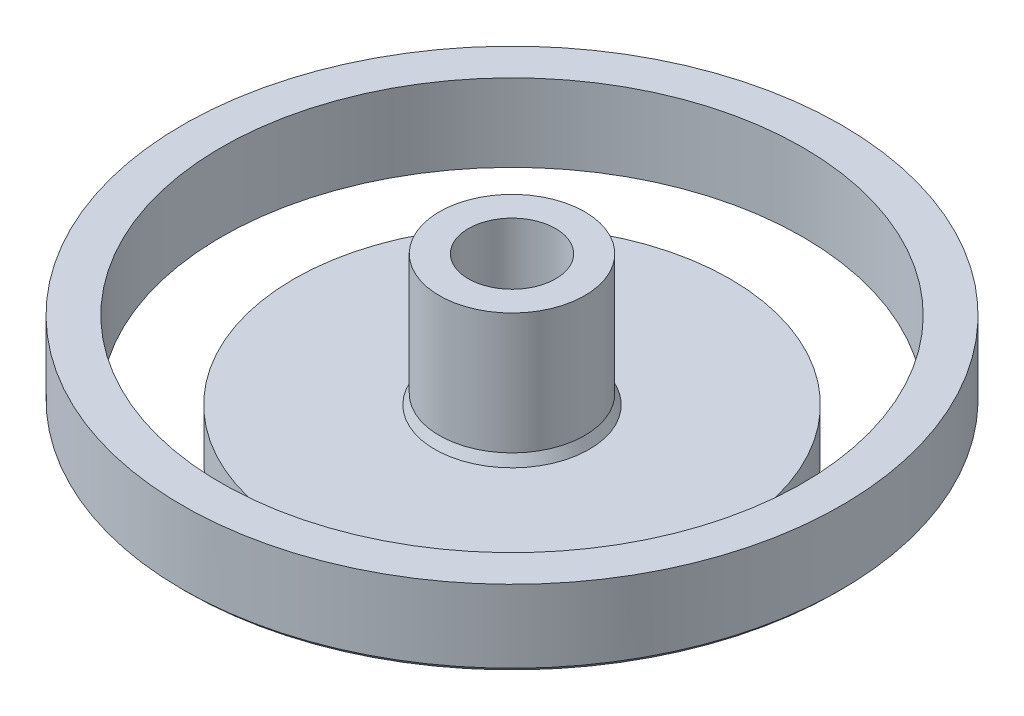
ISO-10303-21;
HEADER;
FILE_DESCRIPTION(('STEP AP214'),'2;1');
FILE_NAME('part.step','',(''),(''),'','','');
FILE_SCHEMA(('AUTOMOTIVE_DESIGN { 1 0 10303 214 1 1 1 1 }'));
ENDSEC;
DATA;
#1=APPLICATION_CONTEXT('core data for automotive mechanical design processes');
#2=APPLICATION_PROTOCOL_DEFINITION('international standard','automotive_design',2000,#1);
#3=PRODUCT_CONTEXT('',#1,'mechanical');
#4=PRODUCT('Part','Part','',(#3));
#5=PRODUCT_RELATED_PRODUCT_CATEGORY('part','',(#4));
#6=PRODUCT_DEFINITION_FORMATION('','',#4);
#7=PRODUCT_DEFINITION_CONTEXT('part definition',#1,'design');
#8=PRODUCT_DEFINITION('design','',#6,#7);
#9=PRODUCT_DEFINITION_SHAPE('','',#8);
#10=(LENGTH_UNIT() NAMED_UNIT(*) SI_UNIT(.MILLI.,.METRE.));
#11=(NAMED_UNIT(*) PLANE_ANGLE_UNIT() SI_UNIT($,.RADIAN.));
#12=(NAMED_UNIT(*) SI_UNIT($,.STERADIAN.) SOLID_ANGLE_UNIT());
#13=UNCERTAINTY_MEASURE_WITH_UNIT(LENGTH_MEASURE(1.E-05),#10,'distance_accuracy_value','');
#14=(GEOMETRIC_REPRESENTATION_CONTEXT(3) GLOBAL_UNCERTAINTY_ASSIGNED_CONTEXT((#13)) GLOBAL_UNIT_ASSIGNED_CONTEXT((#10,
#11,#12)) REPRESENTATION_CONTEXT('',''));
#15=CARTESIAN_POINT('',(0.,0.,0.));
#16=DIRECTION('',(0.,0.,1.));
#17=DIRECTION('',(1.,0.,0.));
#18=AXIS2_PLACEMENT_3D('',#15,#16,#17);
#19=CARTESIAN_POINT('',(0.,0.,0.));
#20=DIRECTION('',(0.,-1.,0.));
#21=DIRECTION('',(0.,0.,-1.));
#22=AXIS2_PLACEMENT_3D('',#19,#20,#21);
#23=CYLINDRICAL_SURFACE('',#22,60.);
#24=CARTESIAN_POINT('',(0.,10.,0.));
#25=DIRECTION('',(0.,-1.,0.));
#26=DIRECTION('',(0.,0.,-1.));
#27=AXIS2_PLACEMENT_3D('',#24,#25,#26);
#28=CIRCLE('',#27,60.);
#29=CARTESIAN_POINT('',(0.,10.,-60.));
#30=VERTEX_POINT('',#29);
#31=EDGE_CURVE('E65',#30,#30,#28,.T.);
#32=ORIENTED_EDGE('',*,*,#31,.T.);
#33=EDGE_LOOP('',(#32));
#34=FACE_BOUND('',#33,.T.);
#35=CARTESIAN_POINT('',(0.,26.,0.));
#36=DIRECTION('',(0.,-1.,0.));
#37=DIRECTION('',(0.,0.,-1.));
#38=AXIS2_PLACEMENT_3D('',#35,#36,#37);
#39=CIRCLE('',#38,60.);
#40=CARTESIAN_POINT('',(0.,26.,-60.));
#41=VERTEX_POINT('',#40);
#42=EDGE_CURVE('E56',#41,#41,#39,.T.);
#43=ORIENTED_EDGE('',*,*,#42,.F.);
#44=EDGE_LOOP('',(#43));
#45=FACE_BOUND('',#44,.T.);
#46=ADVANCED_FACE('F44',(#34,#45),#23,.F.);
#47=CARTESIAN_POINT('',(0.,26.,0.));
#48=DIRECTION('',(0.,1.,0.));
#49=DIRECTION('',(0.,0.,1.));
#50=AXIS2_PLACEMENT_3D('',#47,#48,#49);
#51=PLANE('',#50);
#52=ORIENTED_EDGE('',*,*,#42,.T.);
#53=EDGE_LOOP('',(#52));
#54=FACE_BOUND('',#53,.T.);
#55=CARTESIAN_POINT('',(0.,26.,0.));
#56=DIRECTION('',(0.,-1.,0.));
#57=DIRECTION('',(0.,0.,-1.));
#58=AXIS2_PLACEMENT_3D('',#55,#56,#57);
#59=CIRCLE('',#58,68.);
#60=CARTESIAN_POINT('',(0.,26.,-68.));
#61=VERTEX_POINT('',#60);
#62=EDGE_CURVE('E60',#61,#61,#59,.T.);
#63=ORIENTED_EDGE('',*,*,#62,.F.);
#64=EDGE_LOOP('',(#63));
#65=FACE_BOUND('',#64,.T.);
#66=ADVANCED_FACE('F80',(#54,#65),#51,.T.);
#67=CARTESIAN_POINT('',(0.,0.,0.));
#68=DIRECTION('',(0.,-1.,0.));
#69=DIRECTION('',(0.,0.,-1.));
#70=AXIS2_PLACEMENT_3D('',#67,#68,#69);
#71=CYLINDRICAL_SURFACE('',#70,68.);
#72=CARTESIAN_POINT('',(0.,11.,0.));
#73=DIRECTION('',(0.,1.,0.));
#74=DIRECTION('',(0.,0.,1.));
#75=AXIS2_PLACEMENT_3D('',#72,#73,#74);
#76=CIRCLE('',#75,68.);
#77=CARTESIAN_POINT('',(0.,11.,68.));
#78=VERTEX_POINT('',#77);
#79=EDGE_CURVE('E11',#78,#78,#76,.T.);
#80=ORIENTED_EDGE('',*,*,#79,.T.);
#81=EDGE_LOOP('',(#80));
#82=FACE_BOUND('',#81,.T.);
#83=ORIENTED_EDGE('',*,*,#62,.T.);
#84=EDGE_LOOP('',(#83));
#85=FACE_BOUND('',#84,.T.);
#86=ADVANCED_FACE('F73',(#82,#85),#71,.T.);
#87=CARTESIAN_POINT('',(0.,9.99999999999999,0.));
#88=DIRECTION('',(0.,1.,0.));
#89=DIRECTION('',(0.,0.,1.));
#90=AXIS2_PLACEMENT_3D('',#87,#88,#89);
#91=PLANE('',#90);
#92=CARTESIAN_POINT('',(0.,9.99999999999999,0.));
#93=DIRECTION('',(0.,1.,0.));
#94=DIRECTION('',(0.,0.,1.));
#95=AXIS2_PLACEMENT_3D('',#92,#93,#94);
#96=CIRCLE('',#95,67.);
#97=CARTESIAN_POINT('',(0.,9.99999999999999,67.));
#98=VERTEX_POINT('',#97);
#99=EDGE_CURVE('E52',#98,#98,#96,.F.);
#100=ORIENTED_EDGE('',*,*,#99,.T.);
#101=EDGE_LOOP('',(#100));
#102=FACE_BOUND('',#101,.T.);
#103=ORIENTED_EDGE('',*,*,#31,.F.);
#104=EDGE_LOOP('',(#103));
#105=FACE_BOUND('',#104,.T.);
#106=ADVANCED_FACE('F71',(#102,#105),#91,.F.);
#107=CARTESIAN_POINT('',(0.,9.99999999999999,0.));
#108=DIRECTION('',(0.,1.,0.));
#109=DIRECTION('',(0.,0.,1.));
#110=AXIS2_PLACEMENT_3D('',#107,#108,#109);
#111=CONICAL_SURFACE('',#110,67.,0.785398163397441);
#112=ORIENTED_EDGE('',*,*,#79,.F.);
#113=EDGE_LOOP('',(#112));
#114=FACE_BOUND('',#113,.T.);
#115=ORIENTED_EDGE('',*,*,#99,.F.);
#116=EDGE_LOOP('',(#115));
#117=FACE_BOUND('',#116,.T.);
#118=ADVANCED_FACE('F47',(#114,#117),#111,.T.);
#119=CLOSED_SHELL('',(#46,#66,#86,#106,#118));
#120=MANIFOLD_SOLID_BREP('B2',#119);
#121=CARTESIAN_POINT('',(0.,0.,0.));
#122=DIRECTION('',(0.,-1.,0.));
#123=DIRECTION('',(0.,0.,-1.));
#124=AXIS2_PLACEMENT_3D('',#121,#122,#123);
#125=CYLINDRICAL_SURFACE('',#124,45.);
#126=CARTESIAN_POINT('',(0.,10.,0.));
#127=DIRECTION('',(0.,-1.,0.));
#128=DIRECTION('',(0.,0.,-1.));
#129=AXIS2_PLACEMENT_3D('',#126,#127,#128);
#130=CIRCLE('',#129,45.);
#131=CARTESIAN_POINT('',(0.,10.,-45.));
#132=VERTEX_POINT('',#131);
#133=EDGE_CURVE('E218',#132,#132,#130,.T.);
#134=ORIENTED_EDGE('',*,*,#133,.T.);
#135=EDGE_LOOP('',(#134));
#136=FACE_BOUND('',#135,.T.);
#137=CARTESIAN_POINT('',(0.,0.,0.));
#138=DIRECTION('',(0.,-1.,0.));
#139=DIRECTION('',(0.,0.,-1.));
#140=AXIS2_PLACEMENT_3D('',#137,#138,#139);
#141=CIRCLE('',#140,45.);
#142=CARTESIAN_POINT('',(0.,0.,-45.));
#143=VERTEX_POINT('',#142);
#144=EDGE_CURVE('E179',#143,#143,#141,.T.);
#145=ORIENTED_EDGE('',*,*,#144,.F.);
#146=EDGE_LOOP('',(#145));
#147=FACE_BOUND('',#146,.T.);
#148=ADVANCED_FACE('F123',(#136,#147),#125,.T.);
#149=CARTESIAN_POINT('',(0.,0.,0.));
#150=DIRECTION('',(0.,-1.,0.));
#151=DIRECTION('',(0.,0.,-1.));
#152=AXIS2_PLACEMENT_3D('',#149,#150,#151);
#153=PLANE('',#152);
#154=ORIENTED_EDGE('',*,*,#144,.T.);
#155=EDGE_LOOP('',(#154));
#156=FACE_BOUND('',#155,.T.);
#157=CARTESIAN_POINT('',(0.,0.,0.));
#158=DIRECTION('',(0.,-1.,0.));
#159=DIRECTION('',(0.,0.,-1.));
#160=AXIS2_PLACEMENT_3D('',#157,#158,#159);
#161=CIRCLE('',#160,34.4);
#162=CARTESIAN_POINT('',(0.,0.,-34.4));
#163=VERTEX_POINT('',#162);
#164=EDGE_CURVE('E182',#163,#163,#161,.T.);
#165=ORIENTED_EDGE('',*,*,#164,.F.);
#166=EDGE_LOOP('',(#165));
#167=FACE_BOUND('',#166,.T.);
#168=ADVANCED_FACE('F241',(#156,#167),#153,.T.);
#169=CARTESIAN_POINT('',(0.,0.,0.));
#170=DIRECTION('',(0.,-1.,0.));
#171=DIRECTION('',(0.,0.,-1.));
#172=AXIS2_PLACEMENT_3D('',#169,#170,#171);
#173=CYLINDRICAL_SURFACE('',#172,34.4);
#174=CARTESIAN_POINT('',(0.,1.1,0.));
#175=DIRECTION('',(0.,1.,0.));
#176=DIRECTION('',(0.,0.,1.));
#177=AXIS2_PLACEMENT_3D('',#174,#175,#176);
#178=CIRCLE('',#177,34.4);
#179=CARTESIAN_POINT('',(0.,1.1,34.4));
#180=VERTEX_POINT('',#179);
#181=EDGE_CURVE('E130',#180,#180,#178,.T.);
#182=ORIENTED_EDGE('',*,*,#181,.T.);
#183=EDGE_LOOP('',(#182));
#184=FACE_BOUND('',#183,.T.);
#185=ORIENTED_EDGE('',*,*,#164,.T.);
#186=EDGE_LOOP('',(#185));
#187=FACE_BOUND('',#186,.T.);
#188=ADVANCED_FACE('F246',(#184,#187),#173,.F.);
#189=CARTESIAN_POINT('',(0.,1.3,0.));
#190=DIRECTION('',(0.,1.,0.));
#191=DIRECTION('',(0.,0.,1.));
#192=AXIS2_PLACEMENT_3D('',#189,#190,#191);
#193=PLANE('',#192);
#194=CARTESIAN_POINT('',(0.,1.3,0.));
#195=DIRECTION('',(0.,1.,0.));
#196=DIRECTION('',(0.,0.,1.));
#197=AXIS2_PLACEMENT_3D('',#194,#195,#196);
#198=CIRCLE('',#197,34.2);
#199=CARTESIAN_POINT('',(0.,1.3,34.2));
#200=VERTEX_POINT('',#199);
#201=EDGE_CURVE('E134',#200,#200,#198,.F.);
#202=ORIENTED_EDGE('',*,*,#201,.T.);
#203=EDGE_LOOP('',(#202));
#204=FACE_BOUND('',#203,.T.);
#205=CARTESIAN_POINT('',(0.,1.3,0.));
#206=DIRECTION('',(0.,1.,0.));
#207=DIRECTION('',(0.,0.,1.));
#208=AXIS2_PLACEMENT_3D('',#205,#206,#207);
#209=CIRCLE('',#208,32.2);
#210=CARTESIAN_POINT('',(0.,1.3,32.2));
#211=VERTEX_POINT('',#210);
#212=EDGE_CURVE('E138',#211,#211,#209,.T.);
#213=ORIENTED_EDGE('',*,*,#212,.T.);
#214=EDGE_LOOP('',(#213));
#215=FACE_BOUND('',#214,.T.);
#216=ADVANCED_FACE('F282',(#204,#215),#193,.F.);
#217=CARTESIAN_POINT('',(0.,0.,0.));
#218=DIRECTION('',(0.,-1.,0.));
#219=DIRECTION('',(0.,0.,-1.));
#220=AXIS2_PLACEMENT_3D('',#217,#218,#219);
#221=CYLINDRICAL_SURFACE('',#220,32.);
#222=CARTESIAN_POINT('',(0.,1.1,0.));
#223=DIRECTION('',(0.,1.,0.));
#224=DIRECTION('',(0.,0.,1.));
#225=AXIS2_PLACEMENT_3D('',#222,#223,#224);
#226=CIRCLE('',#225,32.);
#227=CARTESIAN_POINT('',(0.,1.1,32.));
#228=VERTEX_POINT('',#227);
#229=EDGE_CURVE('E43',#228,#228,#226,.F.);
#230=ORIENTED_EDGE('',*,*,#229,.T.);
#231=EDGE_LOOP('',(#230));
#232=FACE_BOUND('',#231,.T.);
#233=CARTESIAN_POINT('',(0.,0.,0.));
#234=DIRECTION('',(0.,-1.,0.));
#235=DIRECTION('',(0.,0.,-1.));
#236=AXIS2_PLACEMENT_3D('',#233,#234,#235);
#237=CIRCLE('',#236,32.);
#238=CARTESIAN_POINT('',(0.,0.,-32.));
#239=VERTEX_POINT('',#238);
#240=EDGE_CURVE('E185',#239,#239,#237,.T.);
#241=ORIENTED_EDGE('',*,*,#240,.F.);
#242=EDGE_LOOP('',(#241));
#243=FACE_BOUND('',#242,.T.);
#244=ADVANCED_FACE('F285',(#232,#243),#221,.T.);
#245=CARTESIAN_POINT('',(0.,0.,0.));
#246=DIRECTION('',(0.,-1.,0.));
#247=DIRECTION('',(0.,0.,-1.));
#248=AXIS2_PLACEMENT_3D('',#245,#246,#247);
#249=PLANE('',#248);
#250=ORIENTED_EDGE('',*,*,#240,.T.);
#251=EDGE_LOOP('',(#250));
#252=FACE_BOUND('',#251,.T.);
#253=CARTESIAN_POINT('',(0.,0.,0.));
#254=DIRECTION('',(0.,-1.,0.));
#255=DIRECTION('',(0.,0.,-1.));
#256=AXIS2_PLACEMENT_3D('',#253,#254,#255);
#257=CIRCLE('',#256,29.5);
#258=CARTESIAN_POINT('',(0.,0.,-29.5));
#259=VERTEX_POINT('',#258);
#260=EDGE_CURVE('E188',#259,#259,#257,.T.);
#261=ORIENTED_EDGE('',*,*,#260,.F.);
#262=EDGE_LOOP('',(#261));
#263=FACE_BOUND('',#262,.T.);
#264=ADVANCED_FACE('F293',(#252,#263),#249,.T.);
#265=CARTESIAN_POINT('',(0.,0.,0.));
#266=DIRECTION('',(0.,-1.,0.));
#267=DIRECTION('',(0.,0.,-1.));
#268=AXIS2_PLACEMENT_3D('',#265,#266,#267);
#269=CYLINDRICAL_SURFACE('',#268,29.5);
#270=CARTESIAN_POINT('',(0.,1.1,0.));
#271=DIRECTION('',(0.,1.,0.));
#272=DIRECTION('',(0.,0.,1.));
#273=AXIS2_PLACEMENT_3D('',#270,#271,#272);
#274=CIRCLE('',#273,29.5);
#275=CARTESIAN_POINT('',(0.,1.1,29.5));
#276=VERTEX_POINT('',#275);
#277=EDGE_CURVE('E146',#276,#276,#274,.T.);
#278=ORIENTED_EDGE('',*,*,#277,.T.);
#279=EDGE_LOOP('',(#278));
#280=FACE_BOUND('',#279,.T.);
#281=ORIENTED_EDGE('',*,*,#260,.T.);
#282=EDGE_LOOP('',(#281));
#283=FACE_BOUND('',#282,.T.);
#284=ADVANCED_FACE('F298',(#280,#283),#269,.F.);
#285=CARTESIAN_POINT('',(0.,1.3,0.));
#286=DIRECTION('',(0.,1.,0.));
#287=DIRECTION('',(0.,0.,1.));
#288=AXIS2_PLACEMENT_3D('',#285,#286,#287);
#289=PLANE('',#288);
#290=CARTESIAN_POINT('',(0.,1.3,0.));
#291=DIRECTION('',(0.,1.,0.));
#292=DIRECTION('',(0.,0.,1.));
#293=AXIS2_PLACEMENT_3D('',#290,#291,#292);
#294=CIRCLE('',#293,29.3);
#295=CARTESIAN_POINT('',(0.,1.3,29.3));
#296=VERTEX_POINT('',#295);
#297=EDGE_CURVE('E149',#296,#296,#294,.F.);
#298=ORIENTED_EDGE('',*,*,#297,.T.);
#299=EDGE_LOOP('',(#298));
#300=FACE_BOUND('',#299,.T.);
#301=CARTESIAN_POINT('',(0.,1.3,0.));
#302=DIRECTION('',(0.,1.,0.));
#303=DIRECTION('',(0.,0.,1.));
#304=AXIS2_PLACEMENT_3D('',#301,#302,#303);
#305=CIRCLE('',#304,27.3);
#306=CARTESIAN_POINT('',(0.,1.3,27.3));
#307=VERTEX_POINT('',#306);
#308=EDGE_CURVE('E152',#307,#307,#305,.T.);
#309=ORIENTED_EDGE('',*,*,#308,.T.);
#310=EDGE_LOOP('',(#309));
#311=FACE_BOUND('',#310,.T.);
#312=ADVANCED_FACE('F302',(#300,#311),#289,.F.);
#313=CARTESIAN_POINT('',(0.,0.,0.));
#314=DIRECTION('',(0.,-1.,0.));
#315=DIRECTION('',(0.,0.,-1.));
#316=AXIS2_PLACEMENT_3D('',#313,#314,#315);
#317=CYLINDRICAL_SURFACE('',#316,27.1);
#318=CARTESIAN_POINT('',(0.,1.1,0.));
#319=DIRECTION('',(0.,1.,0.));
#320=DIRECTION('',(0.,0.,1.));
#321=AXIS2_PLACEMENT_3D('',#318,#319,#320);
#322=CIRCLE('',#321,27.1);
#323=CARTESIAN_POINT('',(0.,1.1,27.1));
#324=VERTEX_POINT('',#323);
#325=EDGE_CURVE('E143',#324,#324,#322,.F.);
#326=ORIENTED_EDGE('',*,*,#325,.T.);
#327=EDGE_LOOP('',(#326));
#328=FACE_BOUND('',#327,.T.);
#329=CARTESIAN_POINT('',(0.,0.,0.));
#330=DIRECTION('',(0.,-1.,0.));
#331=DIRECTION('',(0.,0.,-1.));
#332=AXIS2_PLACEMENT_3D('',#329,#330,#331);
#333=CIRCLE('',#332,27.1);
#334=CARTESIAN_POINT('',(0.,0.,-27.1));
#335=VERTEX_POINT('',#334);
#336=EDGE_CURVE('E191',#335,#335,#333,.T.);
#337=ORIENTED_EDGE('',*,*,#336,.F.);
#338=EDGE_LOOP('',(#337));
#339=FACE_BOUND('',#338,.T.);
#340=ADVANCED_FACE('F306',(#328,#339),#317,.T.);
#341=CARTESIAN_POINT('',(0.,0.,0.));
#342=DIRECTION('',(0.,-1.,0.));
#343=DIRECTION('',(0.,0.,-1.));
#344=AXIS2_PLACEMENT_3D('',#341,#342,#343);
#345=PLANE('',#344);
#346=CARTESIAN_POINT('',(0.,0.,0.));
#347=DIRECTION('',(0.,-1.,0.));
#348=DIRECTION('',(0.,0.,-1.));
#349=AXIS2_PLACEMENT_3D('',#346,#347,#348);
#350=CIRCLE('',#349,25.);
#351=CARTESIAN_POINT('',(0.,0.,-25.));
#352=VERTEX_POINT('',#351);
#353=EDGE_CURVE('E173',#352,#352,#350,.F.);
#354=ORIENTED_EDGE('',*,*,#353,.T.);
#355=EDGE_LOOP('',(#354));
#356=FACE_BOUND('',#355,.T.);
#357=ORIENTED_EDGE('',*,*,#336,.T.);
#358=EDGE_LOOP('',(#357));
#359=FACE_BOUND('',#358,.T.);
#360=ADVANCED_FACE('F310',(#356,#359),#345,.T.);
#361=CARTESIAN_POINT('',(0.,0.,0.));
#362=DIRECTION('',(0.,-1.,0.));
#363=DIRECTION('',(0.,0.,-1.));
#364=AXIS2_PLACEMENT_3D('',#361,#362,#363);
#365=CYLINDRICAL_SURFACE('',#364,24.);
#366=CARTESIAN_POINT('',(0.,4.,0.));
#367=DIRECTION('',(0.,-1.,0.));
#368=DIRECTION('',(0.,0.,-1.));
#369=AXIS2_PLACEMENT_3D('',#366,#367,#368);
#370=CIRCLE('',#369,24.);
#371=CARTESIAN_POINT('',(0.,4.,-24.));
#372=VERTEX_POINT('',#371);
#373=EDGE_CURVE('E167',#372,#372,#370,.F.);
#374=ORIENTED_EDGE('',*,*,#373,.T.);
#375=EDGE_LOOP('',(#374));
#376=FACE_BOUND('',#375,.T.);
#377=CARTESIAN_POINT('',(0.,1.,0.));
#378=DIRECTION('',(0.,-1.,0.));
#379=DIRECTION('',(0.,0.,-1.));
#380=AXIS2_PLACEMENT_3D('',#377,#378,#379);
#381=CIRCLE('',#380,24.);
#382=CARTESIAN_POINT('',(0.,1.,-24.));
#383=VERTEX_POINT('',#382);
#384=EDGE_CURVE('E176',#383,#383,#381,.T.);
#385=ORIENTED_EDGE('',*,*,#384,.T.);
#386=EDGE_LOOP('',(#385));
#387=FACE_BOUND('',#386,.T.);
#388=ADVANCED_FACE('F314',(#376,#387),#365,.F.);
#389=CARTESIAN_POINT('',(0.,5.,0.));
#390=DIRECTION('',(0.,-1.,0.));
#391=DIRECTION('',(0.,0.,-1.));
#392=AXIS2_PLACEMENT_3D('',#389,#390,#391);
#393=PLANE('',#392);
#394=CARTESIAN_POINT('',(0.,5.,0.));
#395=DIRECTION('',(0.,-1.,0.));
#396=DIRECTION('',(0.,0.,-1.));
#397=AXIS2_PLACEMENT_3D('',#394,#395,#396);
#398=CIRCLE('',#397,23.);
#399=CARTESIAN_POINT('',(0.,5.,-23.));
#400=VERTEX_POINT('',#399);
#401=EDGE_CURVE('E170',#400,#400,#398,.T.);
#402=ORIENTED_EDGE('',*,*,#401,.T.);
#403=EDGE_LOOP('',(#402));
#404=FACE_BOUND('',#403,.T.);
#405=CARTESIAN_POINT('',(0.,5.,0.));
#406=DIRECTION('',(0.,-1.,0.));
#407=DIRECTION('',(0.,0.,-1.));
#408=AXIS2_PLACEMENT_3D('',#405,#406,#407);
#409=CIRCLE('',#408,18.4);
#410=CARTESIAN_POINT('',(0.,5.,-18.4));
#411=VERTEX_POINT('',#410);
#412=EDGE_CURVE('E194',#411,#411,#409,.T.);
#413=ORIENTED_EDGE('',*,*,#412,.F.);
#414=EDGE_LOOP('',(#413));
#415=FACE_BOUND('',#414,.T.);
#416=ADVANCED_FACE('F318',(#404,#415),#393,.T.);
#417=CARTESIAN_POINT('',(0.,0.,0.));
#418=DIRECTION('',(0.,-1.,0.));
#419=DIRECTION('',(0.,0.,-1.));
#420=AXIS2_PLACEMENT_3D('',#417,#418,#419);
#421=CYLINDRICAL_SURFACE('',#420,18.4);
#422=CARTESIAN_POINT('',(0.,6.1,0.));
#423=DIRECTION('',(0.,1.,0.));
#424=DIRECTION('',(0.,0.,1.));
#425=AXIS2_PLACEMENT_3D('',#422,#423,#424);
#426=CIRCLE('',#425,18.4);
#427=CARTESIAN_POINT('',(0.,6.1,18.4));
#428=VERTEX_POINT('',#427);
#429=EDGE_CURVE('E158',#428,#428,#426,.T.);
#430=ORIENTED_EDGE('',*,*,#429,.T.);
#431=EDGE_LOOP('',(#430));
#432=FACE_BOUND('',#431,.T.);
#433=ORIENTED_EDGE('',*,*,#412,.T.);
#434=EDGE_LOOP('',(#433));
#435=FACE_BOUND('',#434,.T.);
#436=ADVANCED_FACE('F320',(#432,#435),#421,.F.);
#437=CARTESIAN_POINT('',(0.,6.3,0.));
#438=DIRECTION('',(0.,1.,0.));
#439=DIRECTION('',(0.,0.,1.));
#440=AXIS2_PLACEMENT_3D('',#437,#438,#439);
#441=PLANE('',#440);
#442=CARTESIAN_POINT('',(0.,6.3,0.));
#443=DIRECTION('',(0.,1.,0.));
#444=DIRECTION('',(0.,0.,1.));
#445=AXIS2_PLACEMENT_3D('',#442,#443,#444);
#446=CIRCLE('',#445,18.2);
#447=CARTESIAN_POINT('',(0.,6.3,18.2));
#448=VERTEX_POINT('',#447);
#449=EDGE_CURVE('E161',#448,#448,#446,.F.);
#450=ORIENTED_EDGE('',*,*,#449,.T.);
#451=EDGE_LOOP('',(#450));
#452=FACE_BOUND('',#451,.T.);
#453=CARTESIAN_POINT('',(0.,6.3,0.));
#454=DIRECTION('',(0.,1.,0.));
#455=DIRECTION('',(0.,0.,1.));
#456=AXIS2_PLACEMENT_3D('',#453,#454,#455);
#457=CIRCLE('',#456,16.2);
#458=CARTESIAN_POINT('',(0.,6.3,16.2));
#459=VERTEX_POINT('',#458);
#460=EDGE_CURVE('E164',#459,#459,#457,.T.);
#461=ORIENTED_EDGE('',*,*,#460,.T.);
#462=EDGE_LOOP('',(#461));
#463=FACE_BOUND('',#462,.T.);
#464=ADVANCED_FACE('F323',(#452,#463),#441,.F.);
#465=CARTESIAN_POINT('',(0.,0.,0.));
#466=DIRECTION('',(0.,-1.,0.));
#467=DIRECTION('',(0.,0.,-1.));
#468=AXIS2_PLACEMENT_3D('',#465,#466,#467);
#469=CYLINDRICAL_SURFACE('',#468,16.);
#470=CARTESIAN_POINT('',(0.,6.1,0.));
#471=DIRECTION('',(0.,1.,0.));
#472=DIRECTION('',(0.,0.,1.));
#473=AXIS2_PLACEMENT_3D('',#470,#471,#472);
#474=CIRCLE('',#473,16.);
#475=CARTESIAN_POINT('',(0.,6.1,16.));
#476=VERTEX_POINT('',#475);
#477=EDGE_CURVE('E155',#476,#476,#474,.F.);
#478=ORIENTED_EDGE('',*,*,#477,.T.);
#479=EDGE_LOOP('',(#478));
#480=FACE_BOUND('',#479,.T.);
#481=CARTESIAN_POINT('',(0.,5.,0.));
#482=DIRECTION('',(0.,-1.,0.));
#483=DIRECTION('',(0.,0.,-1.));
#484=AXIS2_PLACEMENT_3D('',#481,#482,#483);
#485=CIRCLE('',#484,16.);
#486=CARTESIAN_POINT('',(0.,5.,-16.));
#487=VERTEX_POINT('',#486);
#488=EDGE_CURVE('E197',#487,#487,#485,.T.);
#489=ORIENTED_EDGE('',*,*,#488,.F.);
#490=EDGE_LOOP('',(#489));
#491=FACE_BOUND('',#490,.T.);
#492=ADVANCED_FACE('F327',(#480,#491),#469,.T.);
#493=ORIENTED_EDGE('',*,*,#488,.T.);
#494=EDGE_LOOP('',(#493));
#495=FACE_BOUND('',#494,.T.);
#496=CARTESIAN_POINT('',(0.,5.,0.));
#497=DIRECTION('',(0.,-1.,0.));
#498=DIRECTION('',(0.,0.,-1.));
#499=AXIS2_PLACEMENT_3D('',#496,#497,#498);
#500=CIRCLE('',#499,13.);
#501=CARTESIAN_POINT('',(0.,5.,-13.));
#502=VERTEX_POINT('',#501);
#503=EDGE_CURVE('E200',#502,#502,#500,.T.);
#504=ORIENTED_EDGE('',*,*,#503,.F.);
#505=EDGE_LOOP('',(#504));
#506=FACE_BOUND('',#505,.T.);
#507=ADVANCED_FACE('F331',(#495,#506),#393,.T.);
#508=CARTESIAN_POINT('',(0.,13.5,0.));
#509=DIRECTION('',(0.,-1.,0.));
#510=DIRECTION('',(0.,0.,-1.));
#511=AXIS2_PLACEMENT_3D('',#508,#509,#510);
#512=CONICAL_SURFACE('',#511,9.00000000000001,0.439842582815735);
#513=ORIENTED_EDGE('',*,*,#503,.T.);
#514=EDGE_LOOP('',(#513));
#515=FACE_BOUND('',#514,.T.);
#516=CARTESIAN_POINT('',(0.,13.5,0.));
#517=DIRECTION('',(0.,-1.,0.));
#518=DIRECTION('',(0.,0.,-1.));
#519=AXIS2_PLACEMENT_3D('',#516,#517,#518);
#520=CIRCLE('',#519,9.00000000000001);
#521=CARTESIAN_POINT('',(0.,13.5,-9.00000000000001));
#522=VERTEX_POINT('',#521);
#523=EDGE_CURVE('E203',#522,#522,#520,.T.);
#524=ORIENTED_EDGE('',*,*,#523,.F.);
#525=EDGE_LOOP('',(#524));
#526=FACE_BOUND('',#525,.T.);
#527=ADVANCED_FACE('F335',(#515,#526),#512,.F.);
#528=CARTESIAN_POINT('',(0.,0.,0.));
#529=DIRECTION('',(0.,-1.,0.));
#530=DIRECTION('',(0.,0.,-1.));
#531=AXIS2_PLACEMENT_3D('',#528,#529,#530);
#532=CYLINDRICAL_SURFACE('',#531,9.00000000000001);
#533=ORIENTED_EDGE('',*,*,#523,.T.);
#534=EDGE_LOOP('',(#533));
#535=FACE_BOUND('',#534,.T.);
#536=CARTESIAN_POINT('',(0.,37.,0.));
#537=DIRECTION('',(0.,-1.,0.));
#538=DIRECTION('',(0.,0.,-1.));
#539=AXIS2_PLACEMENT_3D('',#536,#537,#538);
#540=CIRCLE('',#539,9.00000000000001);
#541=CARTESIAN_POINT('',(0.,37.,-9.00000000000001));
#542=VERTEX_POINT('',#541);
#543=EDGE_CURVE('E206',#542,#542,#540,.T.);
#544=ORIENTED_EDGE('',*,*,#543,.F.);
#545=EDGE_LOOP('',(#544));
#546=FACE_BOUND('',#545,.T.);
#547=ADVANCED_FACE('F339',(#535,#546),#532,.F.);
#548=CARTESIAN_POINT('',(0.,37.,0.));
#549=DIRECTION('',(0.,1.,0.));
#550=DIRECTION('',(0.,0.,1.));
#551=AXIS2_PLACEMENT_3D('',#548,#549,#550);
#552=PLANE('',#551);
#553=ORIENTED_EDGE('',*,*,#543,.T.);
#554=EDGE_LOOP('',(#553));
#555=FACE_BOUND('',#554,.T.);
#556=CARTESIAN_POINT('',(0.,37.,0.));
#557=DIRECTION('',(0.,-1.,0.));
#558=DIRECTION('',(0.,0.,-1.));
#559=AXIS2_PLACEMENT_3D('',#556,#557,#558);
#560=CIRCLE('',#559,15.);
#561=CARTESIAN_POINT('',(0.,37.,-15.));
#562=VERTEX_POINT('',#561);
#563=EDGE_CURVE('E209',#562,#562,#560,.T.);
#564=ORIENTED_EDGE('',*,*,#563,.F.);
#565=EDGE_LOOP('',(#564));
#566=FACE_BOUND('',#565,.T.);
#567=ADVANCED_FACE('F343',(#555,#566),#552,.T.);
#568=CARTESIAN_POINT('',(0.,0.,0.));
#569=DIRECTION('',(0.,-1.,0.));
#570=DIRECTION('',(0.,0.,-1.));
#571=AXIS2_PLACEMENT_3D('',#568,#569,#570);
#572=CYLINDRICAL_SURFACE('',#571,15.);
#573=ORIENTED_EDGE('',*,*,#563,.T.);
#574=EDGE_LOOP('',(#573));
#575=FACE_BOUND('',#574,.T.);
#576=CARTESIAN_POINT('',(0.,12.,0.));
#577=DIRECTION('',(0.,-1.,0.));
#578=DIRECTION('',(0.,0.,-1.));
#579=AXIS2_PLACEMENT_3D('',#576,#577,#578);
#580=CIRCLE('',#579,15.);
#581=CARTESIAN_POINT('',(0.,12.,-15.));
#582=VERTEX_POINT('',#581);
#583=EDGE_CURVE('E212',#582,#582,#580,.T.);
#584=ORIENTED_EDGE('',*,*,#583,.F.);
#585=EDGE_LOOP('',(#584));
#586=FACE_BOUND('',#585,.T.);
#587=ADVANCED_FACE('F237',(#575,#586),#572,.T.);
#588=CARTESIAN_POINT('',(0.,10.,0.));
#589=DIRECTION('',(0.,-1.,0.));
#590=DIRECTION('',(0.,0.,-1.));
#591=AXIS2_PLACEMENT_3D('',#588,#589,#590);
#592=CONICAL_SURFACE('',#591,15.9411764705882,0.439842582815735);
#593=ORIENTED_EDGE('',*,*,#583,.T.);
#594=EDGE_LOOP('',(#593));
#595=FACE_BOUND('',#594,.T.);
#596=CARTESIAN_POINT('',(0.,10.,0.));
#597=DIRECTION('',(0.,-1.,0.));
#598=DIRECTION('',(0.,0.,-1.));
#599=AXIS2_PLACEMENT_3D('',#596,#597,#598);
#600=CIRCLE('',#599,15.9411764705882);
#601=CARTESIAN_POINT('',(0.,10.,-15.9411764705882));
#602=VERTEX_POINT('',#601);
#603=EDGE_CURVE('E215',#602,#602,#600,.T.);
#604=ORIENTED_EDGE('',*,*,#603,.F.);
#605=EDGE_LOOP('',(#604));
#606=FACE_BOUND('',#605,.T.);
#607=ADVANCED_FACE('F227',(#595,#606),#592,.T.);
#608=CARTESIAN_POINT('',(0.,10.,0.));
#609=DIRECTION('',(0.,1.,0.));
#610=DIRECTION('',(0.,0.,1.));
#611=AXIS2_PLACEMENT_3D('',#608,#609,#610);
#612=PLANE('',#611);
#613=ORIENTED_EDGE('',*,*,#603,.T.);
#614=EDGE_LOOP('',(#613));
#615=FACE_BOUND('',#614,.T.);
#616=ORIENTED_EDGE('',*,*,#133,.F.);
#617=EDGE_LOOP('',(#616));
#618=FACE_BOUND('',#617,.T.);
#619=ADVANCED_FACE('F224',(#615,#618),#612,.T.);
#620=CARTESIAN_POINT('',(0.,1.,0.));
#621=DIRECTION('',(0.,-1.,0.));
#622=DIRECTION('',(0.,0.,-1.));
#623=AXIS2_PLACEMENT_3D('',#620,#621,#622);
#624=CONICAL_SURFACE('',#623,24.,0.785398163397457);
#625=ORIENTED_EDGE('',*,*,#353,.F.);
#626=EDGE_LOOP('',(#625));
#627=FACE_BOUND('',#626,.T.);
#628=ORIENTED_EDGE('',*,*,#384,.F.);
#629=EDGE_LOOP('',(#628));
#630=FACE_BOUND('',#629,.T.);
#631=ADVANCED_FACE('F226',(#627,#630),#624,.F.);
#632=CARTESIAN_POINT('',(0.,4.,0.));
#633=DIRECTION('',(0.,-1.,0.));
#634=DIRECTION('',(0.,0.,-1.));
#635=AXIS2_PLACEMENT_3D('',#632,#633,#634);
#636=TOROIDAL_SURFACE('',#635,23.,1.);
#637=ORIENTED_EDGE('',*,*,#373,.F.);
#638=EDGE_LOOP('',(#637));
#639=FACE_BOUND('',#638,.T.);
#640=ORIENTED_EDGE('',*,*,#401,.F.);
#641=EDGE_LOOP('',(#640));
#642=FACE_BOUND('',#641,.T.);
#643=ADVANCED_FACE('F234',(#639,#642),#636,.F.);
#644=CARTESIAN_POINT('',(0.,6.1,0.));
#645=DIRECTION('',(0.,1.,0.));
#646=DIRECTION('',(0.,0.,1.));
#647=AXIS2_PLACEMENT_3D('',#644,#645,#646);
#648=TOROIDAL_SURFACE('',#647,18.2,0.2);
#649=ORIENTED_EDGE('',*,*,#429,.F.);
#650=EDGE_LOOP('',(#649));
#651=FACE_BOUND('',#650,.T.);
#652=ORIENTED_EDGE('',*,*,#449,.F.);
#653=EDGE_LOOP('',(#652));
#654=FACE_BOUND('',#653,.T.);
#655=ADVANCED_FACE('F256',(#651,#654),#648,.F.);
#656=CARTESIAN_POINT('',(0.,6.1,0.));
#657=DIRECTION('',(0.,1.,0.));
#658=DIRECTION('',(0.,0.,1.));
#659=AXIS2_PLACEMENT_3D('',#656,#657,#658);
#660=TOROIDAL_SURFACE('',#659,16.2,0.2);
#661=ORIENTED_EDGE('',*,*,#460,.F.);
#662=EDGE_LOOP('',(#661));
#663=FACE_BOUND('',#662,.T.);
#664=ORIENTED_EDGE('',*,*,#477,.F.);
#665=EDGE_LOOP('',(#664));
#666=FACE_BOUND('',#665,.T.);
#667=ADVANCED_FACE('F260',(#663,#666),#660,.F.);
#668=CARTESIAN_POINT('',(0.,1.1,0.));
#669=DIRECTION('',(0.,1.,0.));
#670=DIRECTION('',(0.,0.,1.));
#671=AXIS2_PLACEMENT_3D('',#668,#669,#670);
#672=TOROIDAL_SURFACE('',#671,29.3,0.2);
#673=ORIENTED_EDGE('',*,*,#277,.F.);
#674=EDGE_LOOP('',(#673));
#675=FACE_BOUND('',#674,.T.);
#676=ORIENTED_EDGE('',*,*,#297,.F.);
#677=EDGE_LOOP('',(#676));
#678=FACE_BOUND('',#677,.T.);
#679=ADVANCED_FACE('F264',(#675,#678),#672,.F.);
#680=CARTESIAN_POINT('',(0.,1.1,0.));
#681=DIRECTION('',(0.,1.,0.));
#682=DIRECTION('',(0.,0.,1.));
#683=AXIS2_PLACEMENT_3D('',#680,#681,#682);
#684=TOROIDAL_SURFACE('',#683,27.3,0.2);
#685=ORIENTED_EDGE('',*,*,#308,.F.);
#686=EDGE_LOOP('',(#685));
#687=FACE_BOUND('',#686,.T.);
#688=ORIENTED_EDGE('',*,*,#325,.F.);
#689=EDGE_LOOP('',(#688));
#690=FACE_BOUND('',#689,.T.);
#691=ADVANCED_FACE('F268',(#687,#690),#684,.F.);
#692=CARTESIAN_POINT('',(0.,1.1,0.));
#693=DIRECTION('',(0.,1.,0.));
#694=DIRECTION('',(0.,0.,1.));
#695=AXIS2_PLACEMENT_3D('',#692,#693,#694);
#696=TOROIDAL_SURFACE('',#695,34.2,0.2);
#697=ORIENTED_EDGE('',*,*,#181,.F.);
#698=EDGE_LOOP('',(#697));
#699=FACE_BOUND('',#698,.T.);
#700=ORIENTED_EDGE('',*,*,#201,.F.);
#701=EDGE_LOOP('',(#700));
#702=FACE_BOUND('',#701,.T.);
#703=ADVANCED_FACE('F271',(#699,#702),#696,.F.);
#704=CARTESIAN_POINT('',(0.,1.1,0.));
#705=DIRECTION('',(0.,1.,0.));
#706=DIRECTION('',(0.,0.,1.));
#707=AXIS2_PLACEMENT_3D('',#704,#705,#706);
#708=TOROIDAL_SURFACE('',#707,32.2,0.2);
#709=ORIENTED_EDGE('',*,*,#212,.F.);
#710=EDGE_LOOP('',(#709));
#711=FACE_BOUND('',#710,.T.);
#712=ORIENTED_EDGE('',*,*,#229,.F.);
#713=EDGE_LOOP('',(#712));
#714=FACE_BOUND('',#713,.T.);
#715=ADVANCED_FACE('F125',(#711,#714),#708,.F.);
#716=CLOSED_SHELL('',(#148,#168,#188,#216,#244,#264,#284,#312,#340,#360,#388,#416,#436,#464,
#492,#507,#527,#547,#567,#587,#607,#619,#631,#643,#655,#667,#679,#691,#703,#715));
#717=MANIFOLD_SOLID_BREP('B6',#716);
#718=ADVANCED_BREP_SHAPE_REPRESENTATION('',(#18,#120,#717),#14);
#719=SHAPE_DEFINITION_REPRESENTATION(#9,#718);
ENDSEC;
END-ISO-10303-21;
